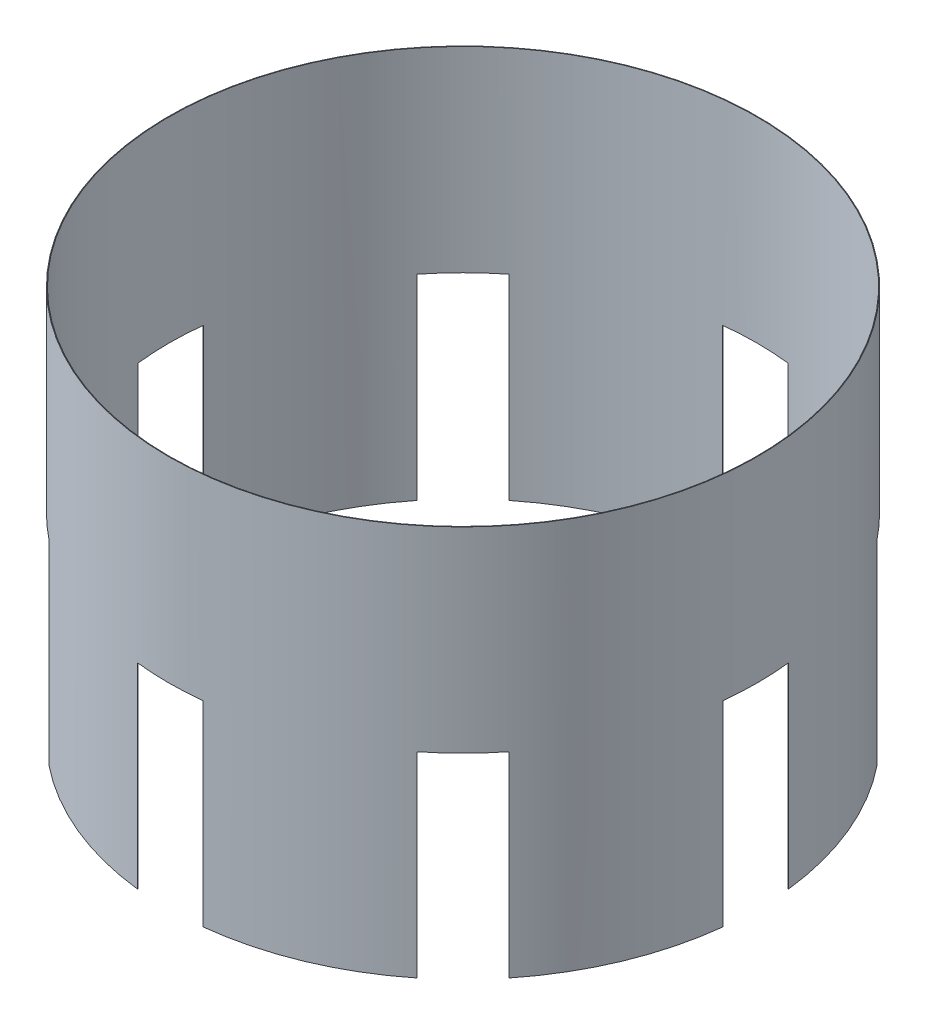
ISO-10303-21;
HEADER;
FILE_DESCRIPTION(('STEP AP214'),'2;1');
FILE_NAME('part.step','',(''),(''),'','','');
FILE_SCHEMA(('AUTOMOTIVE_DESIGN { 1 0 10303 214 1 1 1 1 }'));
ENDSEC;
DATA;
#1=APPLICATION_CONTEXT('core data for automotive mechanical design processes');
#2=APPLICATION_PROTOCOL_DEFINITION('international standard','automotive_design',2000,#1);
#3=PRODUCT_CONTEXT('',#1,'mechanical');
#4=PRODUCT('Part','Part','',(#3));
#5=PRODUCT_RELATED_PRODUCT_CATEGORY('part','',(#4));
#6=PRODUCT_DEFINITION_FORMATION('','',#4);
#7=PRODUCT_DEFINITION_CONTEXT('part definition',#1,'design');
#8=PRODUCT_DEFINITION('design','',#6,#7);
#9=PRODUCT_DEFINITION_SHAPE('','',#8);
#10=(LENGTH_UNIT() NAMED_UNIT(*) SI_UNIT(.MILLI.,.METRE.));
#11=(NAMED_UNIT(*) PLANE_ANGLE_UNIT() SI_UNIT($,.RADIAN.));
#12=(NAMED_UNIT(*) SI_UNIT($,.STERADIAN.) SOLID_ANGLE_UNIT());
#13=UNCERTAINTY_MEASURE_WITH_UNIT(LENGTH_MEASURE(1.E-05),#10,'distance_accuracy_value','');
#14=(GEOMETRIC_REPRESENTATION_CONTEXT(3) GLOBAL_UNCERTAINTY_ASSIGNED_CONTEXT((#13)) GLOBAL_UNIT_ASSIGNED_CONTEXT((#10,
#11,#12)) REPRESENTATION_CONTEXT('',''));
#15=CARTESIAN_POINT('',(0.,0.,0.));
#16=DIRECTION('',(0.,0.,1.));
#17=DIRECTION('',(1.,0.,0.));
#18=AXIS2_PLACEMENT_3D('',#15,#16,#17);
#19=CARTESIAN_POINT('',(0.,1200.,0.));
#20=DIRECTION('',(0.,1.,0.));
#21=DIRECTION('',(0.,0.,1.));
#22=AXIS2_PLACEMENT_3D('',#19,#20,#21);
#23=PLANE('',#22);
#24=CARTESIAN_POINT('',(0.,1200.,0.));
#25=DIRECTION('',(0.,1.,0.));
#26=DIRECTION('',(0.,0.,1.));
#27=AXIS2_PLACEMENT_3D('',#24,#25,#26);
#28=CIRCLE('',#27,451.);
#29=CARTESIAN_POINT('',(-352.294607689771,1200.,-281.583929571115));
#30=VERTEX_POINT('',#29);
#31=CARTESIAN_POINT('',(-448.219812145782,1200.,-49.9999999999988));
#32=VERTEX_POINT('',#31);
#33=EDGE_CURVE('E364',#30,#32,#28,.T.);
#34=ORIENTED_EDGE('',*,*,#33,.F.);
#35=DIRECTION('',(0.707106781186548,0.,0.707106781186547));
#36=VECTOR('',#35,1.);
#37=CARTESIAN_POINT('',(-486.355339059328,1200.,-415.644660940672));
#38=LINE('',#37,#36);
#39=CARTESIAN_POINT('',(-351.583105076166,1200.,-280.87242695751));
#40=VERTEX_POINT('',#39);
#41=EDGE_CURVE('E276',#30,#40,#38,.T.);
#42=ORIENTED_EDGE('',*,*,#41,.T.);
#43=CARTESIAN_POINT('',(0.,1200.,0.));
#44=DIRECTION('',(0.,1.,0.));
#45=DIRECTION('',(0.,0.,1.));
#46=AXIS2_PLACEMENT_3D('',#43,#44,#45);
#47=CIRCLE('',#46,450.);
#48=CARTESIAN_POINT('',(-447.213595499958,1200.,-49.9999999999988));
#49=VERTEX_POINT('',#48);
#50=EDGE_CURVE('E445',#40,#49,#47,.T.);
#51=ORIENTED_EDGE('',*,*,#50,.T.);
#52=DIRECTION('',(1.,0.,0.));
#53=VECTOR('',#52,1.);
#54=CARTESIAN_POINT('',(-451.000000000001,1200.,-49.9999999999988));
#55=LINE('',#54,#53);
#56=EDGE_CURVE('E492',#32,#49,#55,.T.);
#57=ORIENTED_EDGE('',*,*,#56,.F.);
#58=EDGE_LOOP('',(#34,#42,#51,#57));
#59=FACE_BOUND('',#58,.T.);
#60=ADVANCED_FACE('F39',(#59),#23,.F.);
#61=CARTESIAN_POINT('',(-448.219812145782,1200.,50.0000000000012));
#62=VERTEX_POINT('',#61);
#63=CARTESIAN_POINT('',(-352.294607689769,1200.,281.583929571117));
#64=VERTEX_POINT('',#63);
#65=EDGE_CURVE('E274',#62,#64,#28,.T.);
#66=ORIENTED_EDGE('',*,*,#65,.F.);
#67=DIRECTION('',(1.,0.,0.));
#68=VECTOR('',#67,1.);
#69=CARTESIAN_POINT('',(-451.000000000001,1200.,50.0000000000012));
#70=LINE('',#69,#68);
#71=CARTESIAN_POINT('',(-447.213595499958,1200.,50.0000000000012));
#72=VERTEX_POINT('',#71);
#73=EDGE_CURVE('E498',#62,#72,#70,.T.);
#74=ORIENTED_EDGE('',*,*,#73,.T.);
#75=CARTESIAN_POINT('',(-351.583105076164,1200.,280.872426957512));
#76=VERTEX_POINT('',#75);
#77=EDGE_CURVE('E443',#72,#76,#47,.T.);
#78=ORIENTED_EDGE('',*,*,#77,.T.);
#79=DIRECTION('',(0.707106781186545,0.,-0.70710678118655));
#80=VECTOR('',#79,1.);
#81=CARTESIAN_POINT('',(-486.355339059326,1200.,415.644660940674));
#82=LINE('',#81,#80);
#83=EDGE_CURVE('E500',#64,#76,#82,.T.);
#84=ORIENTED_EDGE('',*,*,#83,.F.);
#85=EDGE_LOOP('',(#66,#74,#78,#84));
#86=FACE_BOUND('',#85,.T.);
#87=ADVANCED_FACE('F537',(#86),#23,.F.);
#88=CARTESIAN_POINT('',(-281.583929571114,1200.,352.294607689771));
#89=VERTEX_POINT('',#88);
#90=CARTESIAN_POINT('',(-50.,1200.,448.219812145782));
#91=VERTEX_POINT('',#90);
#92=EDGE_CURVE('E348',#89,#91,#28,.T.);
#93=ORIENTED_EDGE('',*,*,#92,.F.);
#94=DIRECTION('',(0.707106781186545,0.,-0.70710678118655));
#95=VECTOR('',#94,1.);
#96=CARTESIAN_POINT('',(-415.644660940671,1200.,486.355339059329));
#97=LINE('',#96,#95);
#98=CARTESIAN_POINT('',(-280.872426957509,1200.,351.583105076166));
#99=VERTEX_POINT('',#98);
#100=EDGE_CURVE('E493',#89,#99,#97,.T.);
#101=ORIENTED_EDGE('',*,*,#100,.T.);
#102=CARTESIAN_POINT('',(-50.,1200.,447.213595499958));
#103=VERTEX_POINT('',#102);
#104=EDGE_CURVE('E344',#99,#103,#47,.T.);
#105=ORIENTED_EDGE('',*,*,#104,.T.);
#106=DIRECTION('',(0.,0.,1.));
#107=VECTOR('',#106,1.);
#108=CARTESIAN_POINT('',(-50.,1200.,-451.));
#109=LINE('',#108,#107);
#110=EDGE_CURVE('E315',#103,#91,#109,.T.);
#111=ORIENTED_EDGE('',*,*,#110,.T.);
#112=EDGE_LOOP('',(#93,#101,#105,#111));
#113=FACE_BOUND('',#112,.T.);
#114=ADVANCED_FACE('F550',(#113),#23,.F.);
#115=CARTESIAN_POINT('',(352.294607689771,1200.,281.583929571115));
#116=VERTEX_POINT('',#115);
#117=CARTESIAN_POINT('',(448.219812145782,1200.,49.9999999999988));
#118=VERTEX_POINT('',#117);
#119=EDGE_CURVE('E536',#116,#118,#28,.T.);
#120=ORIENTED_EDGE('',*,*,#119,.F.);
#121=DIRECTION('',(0.707106781186548,0.,0.707106781186547));
#122=VECTOR('',#121,1.);
#123=CARTESIAN_POINT('',(-415.644660940673,1200.,-486.355339059327));
#124=LINE('',#123,#122);
#125=CARTESIAN_POINT('',(351.583105076166,1200.,280.87242695751));
#126=VERTEX_POINT('',#125);
#127=EDGE_CURVE('E284',#126,#116,#124,.T.);
#128=ORIENTED_EDGE('',*,*,#127,.F.);
#129=CARTESIAN_POINT('',(447.213595499958,1200.,49.9999999999988));
#130=VERTEX_POINT('',#129);
#131=EDGE_CURVE('E352',#126,#130,#47,.T.);
#132=ORIENTED_EDGE('',*,*,#131,.T.);
#133=EDGE_CURVE('E435',#130,#118,#70,.T.);
#134=ORIENTED_EDGE('',*,*,#133,.T.);
#135=EDGE_LOOP('',(#120,#128,#132,#134));
#136=FACE_BOUND('',#135,.T.);
#137=ADVANCED_FACE('F534',(#136),#23,.F.);
#138=CARTESIAN_POINT('',(447.213595499958,1200.,-50.0000000000012));
#139=VERTEX_POINT('',#138);
#140=CARTESIAN_POINT('',(351.583105076164,1200.,-280.872426957512));
#141=VERTEX_POINT('',#140);
#142=EDGE_CURVE('E452',#139,#141,#47,.T.);
#143=ORIENTED_EDGE('',*,*,#142,.T.);
#144=CARTESIAN_POINT('',(352.294607689769,1200.,-281.583929571117));
#145=VERTEX_POINT('',#144);
#146=EDGE_CURVE('E504',#141,#145,#97,.T.);
#147=ORIENTED_EDGE('',*,*,#146,.T.);
#148=CARTESIAN_POINT('',(448.219812145782,1200.,-50.0000000000012));
#149=VERTEX_POINT('',#148);
#150=EDGE_CURVE('E545',#149,#145,#28,.T.);
#151=ORIENTED_EDGE('',*,*,#150,.F.);
#152=EDGE_CURVE('E490',#139,#149,#55,.T.);
#153=ORIENTED_EDGE('',*,*,#152,.F.);
#154=EDGE_LOOP('',(#143,#147,#151,#153));
#155=FACE_BOUND('',#154,.T.);
#156=ADVANCED_FACE('F556',(#155),#23,.F.);
#157=CARTESIAN_POINT('',(281.583929571114,1200.,-352.294607689771));
#158=VERTEX_POINT('',#157);
#159=CARTESIAN_POINT('',(50.,1200.,-448.219812145782));
#160=VERTEX_POINT('',#159);
#161=EDGE_CURVE('E363',#158,#160,#28,.T.);
#162=ORIENTED_EDGE('',*,*,#161,.F.);
#163=CARTESIAN_POINT('',(280.872426957509,1200.,-351.583105076166));
#164=VERTEX_POINT('',#163);
#165=EDGE_CURVE('E499',#164,#158,#82,.T.);
#166=ORIENTED_EDGE('',*,*,#165,.F.);
#167=CARTESIAN_POINT('',(50.,1200.,-447.213595499958));
#168=VERTEX_POINT('',#167);
#169=EDGE_CURVE('E353',#164,#168,#47,.T.);
#170=ORIENTED_EDGE('',*,*,#169,.T.);
#171=DIRECTION('',(0.,0.,1.));
#172=VECTOR('',#171,1.);
#173=CARTESIAN_POINT('',(50.,1200.,-451.));
#174=LINE('',#173,#172);
#175=EDGE_CURVE('E327',#160,#168,#174,.T.);
#176=ORIENTED_EDGE('',*,*,#175,.F.);
#177=EDGE_LOOP('',(#162,#166,#170,#176));
#178=FACE_BOUND('',#177,.T.);
#179=ADVANCED_FACE('F572',(#178),#23,.F.);
#180=CARTESIAN_POINT('',(-50.,1200.,-447.213595499958));
#181=VERTEX_POINT('',#180);
#182=CARTESIAN_POINT('',(-280.872426957511,1200.,-351.583105076165));
#183=VERTEX_POINT('',#182);
#184=EDGE_CURVE('E354',#181,#183,#47,.T.);
#185=ORIENTED_EDGE('',*,*,#184,.T.);
#186=CARTESIAN_POINT('',(-281.583929571116,1200.,-352.29460768977));
#187=VERTEX_POINT('',#186);
#188=EDGE_CURVE('E474',#187,#183,#124,.T.);
#189=ORIENTED_EDGE('',*,*,#188,.F.);
#190=CARTESIAN_POINT('',(-50.,1200.,-448.219812145782));
#191=VERTEX_POINT('',#190);
#192=EDGE_CURVE('E360',#191,#187,#28,.T.);
#193=ORIENTED_EDGE('',*,*,#192,.F.);
#194=EDGE_CURVE('E318',#191,#181,#109,.T.);
#195=ORIENTED_EDGE('',*,*,#194,.T.);
#196=EDGE_LOOP('',(#185,#189,#193,#195));
#197=FACE_BOUND('',#196,.T.);
#198=ADVANCED_FACE('F472',(#197),#23,.F.);
#199=CARTESIAN_POINT('',(0.,1800.,0.));
#200=DIRECTION('',(0.,1.,0.));
#201=DIRECTION('',(0.,0.,1.));
#202=AXIS2_PLACEMENT_3D('',#199,#200,#201);
#203=PLANE('',#202);
#204=CARTESIAN_POINT('',(0.,1800.,0.));
#205=DIRECTION('',(0.,1.,0.));
#206=DIRECTION('',(0.,0.,1.));
#207=AXIS2_PLACEMENT_3D('',#204,#205,#206);
#208=CIRCLE('',#207,451.);
#209=CARTESIAN_POINT('',(0.,1800.,451.));
#210=VERTEX_POINT('',#209);
#211=EDGE_CURVE('E355',#210,#210,#208,.T.);
#212=ORIENTED_EDGE('',*,*,#211,.T.);
#213=EDGE_LOOP('',(#212));
#214=FACE_BOUND('',#213,.T.);
#215=CARTESIAN_POINT('',(0.,1800.,0.));
#216=DIRECTION('',(0.,1.,0.));
#217=DIRECTION('',(0.,0.,1.));
#218=AXIS2_PLACEMENT_3D('',#215,#216,#217);
#219=CIRCLE('',#218,450.);
#220=CARTESIAN_POINT('',(0.,1800.,450.));
#221=VERTEX_POINT('',#220);
#222=EDGE_CURVE('E345',#221,#221,#219,.T.);
#223=ORIENTED_EDGE('',*,*,#222,.F.);
#224=EDGE_LOOP('',(#223));
#225=FACE_BOUND('',#224,.T.);
#226=ADVANCED_FACE('F564',(#214,#225),#203,.T.);
#227=CARTESIAN_POINT('',(50.,1200.,447.213595499958));
#228=VERTEX_POINT('',#227);
#229=CARTESIAN_POINT('',(280.872426957511,1200.,351.583105076165));
#230=VERTEX_POINT('',#229);
#231=EDGE_CURVE('E349',#228,#230,#47,.T.);
#232=ORIENTED_EDGE('',*,*,#231,.T.);
#233=CARTESIAN_POINT('',(281.583929571116,1200.,352.29460768977));
#234=VERTEX_POINT('',#233);
#235=EDGE_CURVE('E281',#230,#234,#38,.T.);
#236=ORIENTED_EDGE('',*,*,#235,.T.);
#237=CARTESIAN_POINT('',(50.,1200.,448.219812145782));
#238=VERTEX_POINT('',#237);
#239=EDGE_CURVE('E359',#238,#234,#28,.T.);
#240=ORIENTED_EDGE('',*,*,#239,.F.);
#241=EDGE_CURVE('E314',#228,#238,#174,.T.);
#242=ORIENTED_EDGE('',*,*,#241,.F.);
#243=EDGE_LOOP('',(#232,#236,#240,#242));
#244=FACE_BOUND('',#243,.T.);
#245=ADVANCED_FACE('F528',(#244),#23,.F.);
#246=CARTESIAN_POINT('',(0.,1800.,0.));
#247=DIRECTION('',(0.,-1.,0.));
#248=DIRECTION('',(0.,0.,-1.));
#249=AXIS2_PLACEMENT_3D('',#246,#247,#248);
#250=CYLINDRICAL_SURFACE('',#249,451.);
#251=ORIENTED_EDGE('',*,*,#211,.F.);
#252=EDGE_LOOP('',(#251));
#253=FACE_BOUND('',#252,.T.);
#254=CARTESIAN_POINT('',(0.,1500.,0.));
#255=DIRECTION('',(0.,1.,0.));
#256=DIRECTION('',(0.,0.,1.));
#257=AXIS2_PLACEMENT_3D('',#254,#255,#256);
#258=CIRCLE('',#257,451.);
#259=CARTESIAN_POINT('',(281.583929571116,1500.,352.29460768977));
#260=VERTEX_POINT('',#259);
#261=CARTESIAN_POINT('',(352.294607689771,1500.,281.583929571115));
#262=VERTEX_POINT('',#261);
#263=EDGE_CURVE('E261',#260,#262,#258,.T.);
#264=ORIENTED_EDGE('',*,*,#263,.T.);
#265=DIRECTION('',(0.,-1.,0.));
#266=VECTOR('',#265,1.);
#267=CARTESIAN_POINT('',(352.294607689771,1800.,281.583929571115));
#268=LINE('',#267,#266);
#269=EDGE_CURVE('E308',#262,#116,#268,.T.);
#270=ORIENTED_EDGE('',*,*,#269,.T.);
#271=ORIENTED_EDGE('',*,*,#119,.T.);
#272=DIRECTION('',(0.,-1.,0.));
#273=VECTOR('',#272,1.);
#274=CARTESIAN_POINT('',(448.219812145782,1800.,49.9999999999988));
#275=LINE('',#274,#273);
#276=CARTESIAN_POINT('',(448.219812145782,1500.,49.9999999999988));
#277=VERTEX_POINT('',#276);
#278=EDGE_CURVE('E291',#118,#277,#275,.F.);
#279=ORIENTED_EDGE('',*,*,#278,.T.);
#280=CARTESIAN_POINT('',(448.219812145782,1500.,-50.0000000000012));
#281=VERTEX_POINT('',#280);
#282=EDGE_CURVE('E541',#277,#281,#258,.T.);
#283=ORIENTED_EDGE('',*,*,#282,.T.);
#284=DIRECTION('',(0.,-1.,0.));
#285=VECTOR('',#284,1.);
#286=CARTESIAN_POINT('',(448.219812145782,1800.,-50.0000000000012));
#287=LINE('',#286,#285);
#288=EDGE_CURVE('E297',#281,#149,#287,.T.);
#289=ORIENTED_EDGE('',*,*,#288,.T.);
#290=ORIENTED_EDGE('',*,*,#150,.T.);
#291=DIRECTION('',(0.,-1.,0.));
#292=VECTOR('',#291,1.);
#293=CARTESIAN_POINT('',(352.294607689769,1800.,-281.583929571117));
#294=LINE('',#293,#292);
#295=CARTESIAN_POINT('',(352.294607689769,1500.,-281.583929571117));
#296=VERTEX_POINT('',#295);
#297=EDGE_CURVE('E300',#145,#296,#294,.F.);
#298=ORIENTED_EDGE('',*,*,#297,.T.);
#299=CARTESIAN_POINT('',(281.583929571114,1500.,-352.294607689771));
#300=VERTEX_POINT('',#299);
#301=EDGE_CURVE('E539',#296,#300,#258,.T.);
#302=ORIENTED_EDGE('',*,*,#301,.T.);
#303=DIRECTION('',(0.,-1.,0.));
#304=VECTOR('',#303,1.);
#305=CARTESIAN_POINT('',(281.583929571114,1800.,-352.294607689771));
#306=LINE('',#305,#304);
#307=EDGE_CURVE('E294',#300,#158,#306,.T.);
#308=ORIENTED_EDGE('',*,*,#307,.T.);
#309=ORIENTED_EDGE('',*,*,#161,.T.);
#310=DIRECTION('',(0.,-1.,0.));
#311=VECTOR('',#310,1.);
#312=CARTESIAN_POINT('',(50.,1800.,-448.219812145782));
#313=LINE('',#312,#311);
#314=CARTESIAN_POINT('',(50.,1500.,-448.219812145782));
#315=VERTEX_POINT('',#314);
#316=EDGE_CURVE('E329',#160,#315,#313,.F.);
#317=ORIENTED_EDGE('',*,*,#316,.T.);
#318=CARTESIAN_POINT('',(0.,1500.,0.));
#319=DIRECTION('',(0.,1.,0.));
#320=DIRECTION('',(0.,0.,1.));
#321=AXIS2_PLACEMENT_3D('',#318,#319,#320);
#322=CIRCLE('',#321,451.);
#323=CARTESIAN_POINT('',(-50.,1500.,-448.219812145782));
#324=VERTEX_POINT('',#323);
#325=EDGE_CURVE('E337',#315,#324,#322,.T.);
#326=ORIENTED_EDGE('',*,*,#325,.T.);
#327=DIRECTION('',(0.,-1.,0.));
#328=VECTOR('',#327,1.);
#329=CARTESIAN_POINT('',(-50.,1800.,-448.219812145782));
#330=LINE('',#329,#328);
#331=EDGE_CURVE('E341',#324,#191,#330,.T.);
#332=ORIENTED_EDGE('',*,*,#331,.T.);
#333=ORIENTED_EDGE('',*,*,#192,.T.);
#334=DIRECTION('',(0.,-1.,0.));
#335=VECTOR('',#334,1.);
#336=CARTESIAN_POINT('',(-281.583929571116,1800.,-352.29460768977));
#337=LINE('',#336,#335);
#338=CARTESIAN_POINT('',(-281.583929571116,1500.,-352.29460768977));
#339=VERTEX_POINT('',#338);
#340=EDGE_CURVE('E259',#187,#339,#337,.F.);
#341=ORIENTED_EDGE('',*,*,#340,.T.);
#342=CARTESIAN_POINT('',(-352.294607689771,1500.,-281.583929571115));
#343=VERTEX_POINT('',#342);
#344=EDGE_CURVE('E485',#339,#343,#258,.T.);
#345=ORIENTED_EDGE('',*,*,#344,.T.);
#346=DIRECTION('',(0.,-1.,0.));
#347=VECTOR('',#346,1.);
#348=CARTESIAN_POINT('',(-352.294607689771,1800.,-281.583929571115));
#349=LINE('',#348,#347);
#350=EDGE_CURVE('E311',#343,#30,#349,.T.);
#351=ORIENTED_EDGE('',*,*,#350,.T.);
#352=ORIENTED_EDGE('',*,*,#33,.T.);
#353=DIRECTION('',(0.,-1.,0.));
#354=VECTOR('',#353,1.);
#355=CARTESIAN_POINT('',(-448.219812145782,1800.,-49.9999999999988));
#356=LINE('',#355,#354);
#357=CARTESIAN_POINT('',(-448.219812145782,1500.,-49.9999999999988));
#358=VERTEX_POINT('',#357);
#359=EDGE_CURVE('E278',#32,#358,#356,.F.);
#360=ORIENTED_EDGE('',*,*,#359,.T.);
#361=CARTESIAN_POINT('',(-448.219812145782,1500.,50.0000000000012));
#362=VERTEX_POINT('',#361);
#363=EDGE_CURVE('E258',#358,#362,#258,.T.);
#364=ORIENTED_EDGE('',*,*,#363,.T.);
#365=DIRECTION('',(0.,-1.,0.));
#366=VECTOR('',#365,1.);
#367=CARTESIAN_POINT('',(-448.219812145782,1800.,50.0000000000012));
#368=LINE('',#367,#366);
#369=EDGE_CURVE('E289',#362,#62,#368,.T.);
#370=ORIENTED_EDGE('',*,*,#369,.T.);
#371=ORIENTED_EDGE('',*,*,#65,.T.);
#372=DIRECTION('',(0.,-1.,0.));
#373=VECTOR('',#372,1.);
#374=CARTESIAN_POINT('',(-352.294607689769,1800.,281.583929571117));
#375=LINE('',#374,#373);
#376=CARTESIAN_POINT('',(-352.294607689769,1500.,281.583929571117));
#377=VERTEX_POINT('',#376);
#378=EDGE_CURVE('E264',#64,#377,#375,.F.);
#379=ORIENTED_EDGE('',*,*,#378,.T.);
#380=CARTESIAN_POINT('',(-281.583929571114,1500.,352.294607689771));
#381=VERTEX_POINT('',#380);
#382=EDGE_CURVE('E248',#377,#381,#258,.T.);
#383=ORIENTED_EDGE('',*,*,#382,.T.);
#384=DIRECTION('',(0.,-1.,0.));
#385=VECTOR('',#384,1.);
#386=CARTESIAN_POINT('',(-281.583929571114,1800.,352.294607689771));
#387=LINE('',#386,#385);
#388=EDGE_CURVE('E275',#381,#89,#387,.T.);
#389=ORIENTED_EDGE('',*,*,#388,.T.);
#390=ORIENTED_EDGE('',*,*,#92,.T.);
#391=DIRECTION('',(0.,-1.,0.));
#392=VECTOR('',#391,1.);
#393=CARTESIAN_POINT('',(-50.,1800.,448.219812145782));
#394=LINE('',#393,#392);
#395=CARTESIAN_POINT('',(-50.,1500.,448.219812145782));
#396=VERTEX_POINT('',#395);
#397=EDGE_CURVE('E338',#91,#396,#394,.F.);
#398=ORIENTED_EDGE('',*,*,#397,.T.);
#399=CARTESIAN_POINT('',(50.,1500.,448.219812145782));
#400=VERTEX_POINT('',#399);
#401=EDGE_CURVE('E335',#396,#400,#322,.T.);
#402=ORIENTED_EDGE('',*,*,#401,.T.);
#403=DIRECTION('',(0.,-1.,0.));
#404=VECTOR('',#403,1.);
#405=CARTESIAN_POINT('',(50.,1800.,448.219812145782));
#406=LINE('',#405,#404);
#407=EDGE_CURVE('E332',#400,#238,#406,.T.);
#408=ORIENTED_EDGE('',*,*,#407,.T.);
#409=ORIENTED_EDGE('',*,*,#239,.T.);
#410=DIRECTION('',(0.,-1.,0.));
#411=VECTOR('',#410,1.);
#412=CARTESIAN_POINT('',(281.583929571116,1800.,352.29460768977));
#413=LINE('',#412,#411);
#414=EDGE_CURVE('E305',#234,#260,#413,.F.);
#415=ORIENTED_EDGE('',*,*,#414,.T.);
#416=EDGE_LOOP('',(#264,#270,#271,#279,#283,#289,#290,#298,#302,#308,#309,#317,#326,#332,#333,
#341,#345,#351,#352,#360,#364,#370,#371,#379,#383,#389,#390,#398,#402,#408,#409,#415));
#417=FACE_BOUND('',#416,.T.);
#418=ADVANCED_FACE('F41',(#253,#417),#250,.T.);
#419=CARTESIAN_POINT('',(0.,1800.,0.));
#420=DIRECTION('',(0.,-1.,0.));
#421=DIRECTION('',(0.,0.,-1.));
#422=AXIS2_PLACEMENT_3D('',#419,#420,#421);
#423=CYLINDRICAL_SURFACE('',#422,450.);
#424=DIRECTION('',(0.,-1.,0.));
#425=VECTOR('',#424,1.);
#426=CARTESIAN_POINT('',(351.583105076166,1800.,280.87242695751));
#427=LINE('',#426,#425);
#428=CARTESIAN_POINT('',(351.583105076166,1500.,280.87242695751));
#429=VERTEX_POINT('',#428);
#430=EDGE_CURVE('E11',#429,#126,#427,.T.);
#431=ORIENTED_EDGE('',*,*,#430,.F.);
#432=CARTESIAN_POINT('',(0.,1500.,0.));
#433=DIRECTION('',(0.,1.,0.));
#434=DIRECTION('',(0.,0.,1.));
#435=AXIS2_PLACEMENT_3D('',#432,#433,#434);
#436=CIRCLE('',#435,450.);
#437=CARTESIAN_POINT('',(280.872426957511,1500.,351.583105076165));
#438=VERTEX_POINT('',#437);
#439=EDGE_CURVE('E379',#438,#429,#436,.T.);
#440=ORIENTED_EDGE('',*,*,#439,.F.);
#441=DIRECTION('',(0.,-1.,0.));
#442=VECTOR('',#441,1.);
#443=CARTESIAN_POINT('',(280.872426957511,1800.,351.583105076165));
#444=LINE('',#443,#442);
#445=EDGE_CURVE('E47',#230,#438,#444,.F.);
#446=ORIENTED_EDGE('',*,*,#445,.F.);
#447=ORIENTED_EDGE('',*,*,#231,.F.);
#448=DIRECTION('',(0.,-1.,0.));
#449=VECTOR('',#448,1.);
#450=CARTESIAN_POINT('',(50.,1800.,447.213595499958));
#451=LINE('',#450,#449);
#452=CARTESIAN_POINT('',(50.,1500.,447.213595499958));
#453=VERTEX_POINT('',#452);
#454=EDGE_CURVE('E371',#453,#228,#451,.T.);
#455=ORIENTED_EDGE('',*,*,#454,.F.);
#456=CARTESIAN_POINT('',(0.,1500.,0.));
#457=DIRECTION('',(0.,1.,0.));
#458=DIRECTION('',(0.,0.,1.));
#459=AXIS2_PLACEMENT_3D('',#456,#457,#458);
#460=CIRCLE('',#459,450.);
#461=CARTESIAN_POINT('',(-50.,1500.,447.213595499958));
#462=VERTEX_POINT('',#461);
#463=EDGE_CURVE('E369',#462,#453,#460,.T.);
#464=ORIENTED_EDGE('',*,*,#463,.F.);
#465=DIRECTION('',(0.,-1.,0.));
#466=VECTOR('',#465,1.);
#467=CARTESIAN_POINT('',(-50.,1800.,447.213595499958));
#468=LINE('',#467,#466);
#469=EDGE_CURVE('E373',#103,#462,#468,.F.);
#470=ORIENTED_EDGE('',*,*,#469,.F.);
#471=ORIENTED_EDGE('',*,*,#104,.F.);
#472=DIRECTION('',(0.,-1.,0.));
#473=VECTOR('',#472,1.);
#474=CARTESIAN_POINT('',(-280.872426957509,1800.,351.583105076166));
#475=LINE('',#474,#473);
#476=CARTESIAN_POINT('',(-280.872426957509,1500.,351.583105076166));
#477=VERTEX_POINT('',#476);
#478=EDGE_CURVE('E378',#477,#99,#475,.T.);
#479=ORIENTED_EDGE('',*,*,#478,.F.);
#480=CARTESIAN_POINT('',(-351.583105076164,1500.,280.872426957512));
#481=VERTEX_POINT('',#480);
#482=EDGE_CURVE('E376',#481,#477,#436,.T.);
#483=ORIENTED_EDGE('',*,*,#482,.F.);
#484=DIRECTION('',(0.,-1.,0.));
#485=VECTOR('',#484,1.);
#486=CARTESIAN_POINT('',(-351.583105076164,1800.,280.872426957512));
#487=LINE('',#486,#485);
#488=EDGE_CURVE('E267',#76,#481,#487,.F.);
#489=ORIENTED_EDGE('',*,*,#488,.F.);
#490=ORIENTED_EDGE('',*,*,#77,.F.);
#491=DIRECTION('',(0.,-1.,0.));
#492=VECTOR('',#491,1.);
#493=CARTESIAN_POINT('',(-447.213595499958,1800.,50.0000000000012));
#494=LINE('',#493,#492);
#495=CARTESIAN_POINT('',(-447.213595499958,1500.,50.0000000000012));
#496=VERTEX_POINT('',#495);
#497=EDGE_CURVE('E384',#496,#72,#494,.T.);
#498=ORIENTED_EDGE('',*,*,#497,.F.);
#499=CARTESIAN_POINT('',(-447.213595499958,1500.,-49.9999999999988));
#500=VERTEX_POINT('',#499);
#501=EDGE_CURVE('E380',#500,#496,#436,.T.);
#502=ORIENTED_EDGE('',*,*,#501,.F.);
#503=DIRECTION('',(0.,-1.,0.));
#504=VECTOR('',#503,1.);
#505=CARTESIAN_POINT('',(-447.213595499958,1800.,-49.9999999999988));
#506=LINE('',#505,#504);
#507=EDGE_CURVE('E382',#49,#500,#506,.F.);
#508=ORIENTED_EDGE('',*,*,#507,.F.);
#509=ORIENTED_EDGE('',*,*,#50,.F.);
#510=DIRECTION('',(0.,-1.,0.));
#511=VECTOR('',#510,1.);
#512=CARTESIAN_POINT('',(-351.583105076166,1800.,-280.87242695751));
#513=LINE('',#512,#511);
#514=CARTESIAN_POINT('',(-351.583105076166,1500.,-280.87242695751));
#515=VERTEX_POINT('',#514);
#516=EDGE_CURVE('E399',#515,#40,#513,.T.);
#517=ORIENTED_EDGE('',*,*,#516,.F.);
#518=CARTESIAN_POINT('',(-280.872426957511,1500.,-351.583105076165));
#519=VERTEX_POINT('',#518);
#520=EDGE_CURVE('E398',#519,#515,#436,.T.);
#521=ORIENTED_EDGE('',*,*,#520,.F.);
#522=DIRECTION('',(0.,-1.,0.));
#523=VECTOR('',#522,1.);
#524=CARTESIAN_POINT('',(-280.872426957511,1800.,-351.583105076165));
#525=LINE('',#524,#523);
#526=EDGE_CURVE('E396',#183,#519,#525,.F.);
#527=ORIENTED_EDGE('',*,*,#526,.F.);
#528=ORIENTED_EDGE('',*,*,#184,.F.);
#529=DIRECTION('',(0.,-1.,0.));
#530=VECTOR('',#529,1.);
#531=CARTESIAN_POINT('',(-50.,1800.,-447.213595499958));
#532=LINE('',#531,#530);
#533=CARTESIAN_POINT('',(-50.,1500.,-447.213595499958));
#534=VERTEX_POINT('',#533);
#535=EDGE_CURVE('E368',#534,#181,#532,.T.);
#536=ORIENTED_EDGE('',*,*,#535,.F.);
#537=CARTESIAN_POINT('',(50.,1500.,-447.213595499958));
#538=VERTEX_POINT('',#537);
#539=EDGE_CURVE('E366',#538,#534,#460,.T.);
#540=ORIENTED_EDGE('',*,*,#539,.F.);
#541=DIRECTION('',(0.,-1.,0.));
#542=VECTOR('',#541,1.);
#543=CARTESIAN_POINT('',(50.,1800.,-447.213595499958));
#544=LINE('',#543,#542);
#545=EDGE_CURVE('E358',#168,#538,#544,.F.);
#546=ORIENTED_EDGE('',*,*,#545,.F.);
#547=ORIENTED_EDGE('',*,*,#169,.F.);
#548=DIRECTION('',(0.,-1.,0.));
#549=VECTOR('',#548,1.);
#550=CARTESIAN_POINT('',(280.872426957509,1800.,-351.583105076166));
#551=LINE('',#550,#549);
#552=CARTESIAN_POINT('',(280.872426957509,1500.,-351.583105076166));
#553=VERTEX_POINT('',#552);
#554=EDGE_CURVE('E391',#553,#164,#551,.T.);
#555=ORIENTED_EDGE('',*,*,#554,.F.);
#556=CARTESIAN_POINT('',(351.583105076164,1500.,-280.872426957512));
#557=VERTEX_POINT('',#556);
#558=EDGE_CURVE('E393',#557,#553,#436,.T.);
#559=ORIENTED_EDGE('',*,*,#558,.F.);
#560=DIRECTION('',(0.,-1.,0.));
#561=VECTOR('',#560,1.);
#562=CARTESIAN_POINT('',(351.583105076164,1800.,-280.872426957512));
#563=LINE('',#562,#561);
#564=EDGE_CURVE('E394',#141,#557,#563,.F.);
#565=ORIENTED_EDGE('',*,*,#564,.F.);
#566=ORIENTED_EDGE('',*,*,#142,.F.);
#567=DIRECTION('',(0.,-1.,0.));
#568=VECTOR('',#567,1.);
#569=CARTESIAN_POINT('',(447.213595499958,1800.,-50.0000000000012));
#570=LINE('',#569,#568);
#571=CARTESIAN_POINT('',(447.213595499958,1500.,-50.0000000000012));
#572=VERTEX_POINT('',#571);
#573=EDGE_CURVE('E389',#572,#139,#570,.T.);
#574=ORIENTED_EDGE('',*,*,#573,.F.);
#575=CARTESIAN_POINT('',(447.213595499958,1500.,49.9999999999988));
#576=VERTEX_POINT('',#575);
#577=EDGE_CURVE('E388',#576,#572,#436,.T.);
#578=ORIENTED_EDGE('',*,*,#577,.F.);
#579=DIRECTION('',(0.,-1.,0.));
#580=VECTOR('',#579,1.);
#581=CARTESIAN_POINT('',(447.213595499958,1800.,49.9999999999988));
#582=LINE('',#581,#580);
#583=EDGE_CURVE('E386',#130,#576,#582,.F.);
#584=ORIENTED_EDGE('',*,*,#583,.F.);
#585=ORIENTED_EDGE('',*,*,#131,.F.);
#586=EDGE_LOOP('',(#431,#440,#446,#447,#455,#464,#470,#471,#479,#483,#489,#490,#498,#502,#508,
#509,#517,#521,#527,#528,#536,#540,#546,#547,#555,#559,#565,#566,#574,#578,#584,#585));
#587=FACE_BOUND('',#586,.T.);
#588=ORIENTED_EDGE('',*,*,#222,.T.);
#589=EDGE_LOOP('',(#588));
#590=FACE_BOUND('',#589,.T.);
#591=ADVANCED_FACE('F440',(#587,#590),#423,.F.);
#592=CARTESIAN_POINT('',(50.,1500.,-451.));
#593=DIRECTION('',(1.,0.,0.));
#594=DIRECTION('',(0.,1.,0.));
#595=AXIS2_PLACEMENT_3D('',#592,#593,#594);
#596=PLANE('',#595);
#597=ORIENTED_EDGE('',*,*,#175,.T.);
#598=ORIENTED_EDGE('',*,*,#545,.T.);
#599=DIRECTION('',(0.,0.,1.));
#600=VECTOR('',#599,1.);
#601=CARTESIAN_POINT('',(50.,1500.,-451.));
#602=LINE('',#601,#600);
#603=EDGE_CURVE('E323',#315,#538,#602,.T.);
#604=ORIENTED_EDGE('',*,*,#603,.F.);
#605=ORIENTED_EDGE('',*,*,#316,.F.);
#606=EDGE_LOOP('',(#597,#598,#604,#605));
#607=FACE_BOUND('',#606,.T.);
#608=ADVANCED_FACE('F581',(#607),#596,.F.);
#609=CARTESIAN_POINT('',(-50.,1500.,-451.));
#610=DIRECTION('',(0.,1.,0.));
#611=DIRECTION('',(0.,0.,1.));
#612=AXIS2_PLACEMENT_3D('',#609,#610,#611);
#613=PLANE('',#612);
#614=ORIENTED_EDGE('',*,*,#603,.T.);
#615=ORIENTED_EDGE('',*,*,#539,.T.);
#616=DIRECTION('',(0.,0.,1.));
#617=VECTOR('',#616,1.);
#618=CARTESIAN_POINT('',(-50.,1500.,-451.));
#619=LINE('',#618,#617);
#620=EDGE_CURVE('E319',#324,#534,#619,.T.);
#621=ORIENTED_EDGE('',*,*,#620,.F.);
#622=ORIENTED_EDGE('',*,*,#325,.F.);
#623=EDGE_LOOP('',(#614,#615,#621,#622));
#624=FACE_BOUND('',#623,.T.);
#625=ADVANCED_FACE('F587',(#624),#613,.F.);
#626=CARTESIAN_POINT('',(-50.,1200.,-451.));
#627=DIRECTION('',(-1.,0.,0.));
#628=DIRECTION('',(0.,0.,1.));
#629=AXIS2_PLACEMENT_3D('',#626,#627,#628);
#630=PLANE('',#629);
#631=ORIENTED_EDGE('',*,*,#620,.T.);
#632=ORIENTED_EDGE('',*,*,#535,.T.);
#633=ORIENTED_EDGE('',*,*,#194,.F.);
#634=ORIENTED_EDGE('',*,*,#331,.F.);
#635=EDGE_LOOP('',(#631,#632,#633,#634));
#636=FACE_BOUND('',#635,.T.);
#637=ADVANCED_FACE('F590',(#636),#630,.F.);
#638=ORIENTED_EDGE('',*,*,#110,.F.);
#639=ORIENTED_EDGE('',*,*,#469,.T.);
#640=EDGE_CURVE('E320',#462,#396,#619,.T.);
#641=ORIENTED_EDGE('',*,*,#640,.T.);
#642=ORIENTED_EDGE('',*,*,#397,.F.);
#643=EDGE_LOOP('',(#638,#639,#641,#642));
#644=FACE_BOUND('',#643,.T.);
#645=ADVANCED_FACE('F516',(#644),#630,.F.);
#646=ORIENTED_EDGE('',*,*,#401,.F.);
#647=ORIENTED_EDGE('',*,*,#640,.F.);
#648=ORIENTED_EDGE('',*,*,#463,.T.);
#649=EDGE_CURVE('E324',#453,#400,#602,.T.);
#650=ORIENTED_EDGE('',*,*,#649,.T.);
#651=EDGE_LOOP('',(#646,#647,#648,#650));
#652=FACE_BOUND('',#651,.T.);
#653=ADVANCED_FACE('F519',(#652),#613,.F.);
#654=ORIENTED_EDGE('',*,*,#649,.F.);
#655=ORIENTED_EDGE('',*,*,#454,.T.);
#656=ORIENTED_EDGE('',*,*,#241,.T.);
#657=ORIENTED_EDGE('',*,*,#407,.F.);
#658=EDGE_LOOP('',(#654,#655,#656,#657));
#659=FACE_BOUND('',#658,.T.);
#660=ADVANCED_FACE('F524',(#659),#596,.F.);
#661=CARTESIAN_POINT('',(-415.644660940671,1200.,486.355339059329));
#662=DIRECTION('',(0.70710678118655,0.,0.707106781186545));
#663=DIRECTION('',(0.707106781186545,0.,-0.70710678118655));
#664=AXIS2_PLACEMENT_3D('',#661,#662,#663);
#665=PLANE('',#664);
#666=DIRECTION('',(0.707106781186545,0.,-0.70710678118655));
#667=VECTOR('',#666,1.);
#668=CARTESIAN_POINT('',(-415.644660940671,1500.,486.355339059329));
#669=LINE('',#668,#667);
#670=EDGE_CURVE('E254',#381,#477,#669,.T.);
#671=ORIENTED_EDGE('',*,*,#670,.T.);
#672=ORIENTED_EDGE('',*,*,#478,.T.);
#673=ORIENTED_EDGE('',*,*,#100,.F.);
#674=ORIENTED_EDGE('',*,*,#388,.F.);
#675=EDGE_LOOP('',(#671,#672,#673,#674));
#676=FACE_BOUND('',#675,.T.);
#677=ADVANCED_FACE('F509',(#676),#665,.F.);
#678=CARTESIAN_POINT('',(-486.355339059326,1500.,415.644660940674));
#679=DIRECTION('',(-0.70710678118655,0.,-0.707106781186545));
#680=DIRECTION('',(-0.707106781186545,0.,0.70710678118655));
#681=AXIS2_PLACEMENT_3D('',#678,#679,#680);
#682=PLANE('',#681);
#683=ORIENTED_EDGE('',*,*,#83,.T.);
#684=ORIENTED_EDGE('',*,*,#488,.T.);
#685=DIRECTION('',(0.707106781186545,0.,-0.70710678118655));
#686=VECTOR('',#685,1.);
#687=CARTESIAN_POINT('',(-486.355339059326,1500.,415.644660940674));
#688=LINE('',#687,#686);
#689=EDGE_CURVE('E251',#377,#481,#688,.T.);
#690=ORIENTED_EDGE('',*,*,#689,.F.);
#691=ORIENTED_EDGE('',*,*,#378,.F.);
#692=EDGE_LOOP('',(#683,#684,#690,#691));
#693=FACE_BOUND('',#692,.T.);
#694=ADVANCED_FACE('F263',(#693),#682,.F.);
#695=CARTESIAN_POINT('',(-486.355339059328,1500.,-415.644660940672));
#696=DIRECTION('',(0.,1.,0.));
#697=DIRECTION('',(0.,0.,1.));
#698=AXIS2_PLACEMENT_3D('',#695,#696,#697);
#699=PLANE('',#698);
#700=ORIENTED_EDGE('',*,*,#689,.T.);
#701=ORIENTED_EDGE('',*,*,#482,.T.);
#702=ORIENTED_EDGE('',*,*,#670,.F.);
#703=ORIENTED_EDGE('',*,*,#382,.F.);
#704=EDGE_LOOP('',(#700,#701,#702,#703));
#705=FACE_BOUND('',#704,.T.);
#706=ADVANCED_FACE('F250',(#705),#699,.F.);
#707=CARTESIAN_POINT('',(-451.000000000001,1200.,50.0000000000012));
#708=DIRECTION('',(0.,0.,1.));
#709=DIRECTION('',(1.,0.,0.));
#710=AXIS2_PLACEMENT_3D('',#707,#708,#709);
#711=PLANE('',#710);
#712=DIRECTION('',(1.,0.,0.));
#713=VECTOR('',#712,1.);
#714=CARTESIAN_POINT('',(-451.000000000001,1500.,50.0000000000012));
#715=LINE('',#714,#713);
#716=EDGE_CURVE('E425',#362,#496,#715,.T.);
#717=ORIENTED_EDGE('',*,*,#716,.T.);
#718=ORIENTED_EDGE('',*,*,#497,.T.);
#719=ORIENTED_EDGE('',*,*,#73,.F.);
#720=ORIENTED_EDGE('',*,*,#369,.F.);
#721=EDGE_LOOP('',(#717,#718,#719,#720));
#722=FACE_BOUND('',#721,.T.);
#723=ADVANCED_FACE('F433',(#722),#711,.F.);
#724=CARTESIAN_POINT('',(-451.000000000001,1500.,-49.9999999999988));
#725=DIRECTION('',(0.,0.,-1.));
#726=DIRECTION('',(-1.,0.,0.));
#727=AXIS2_PLACEMENT_3D('',#724,#725,#726);
#728=PLANE('',#727);
#729=ORIENTED_EDGE('',*,*,#56,.T.);
#730=ORIENTED_EDGE('',*,*,#507,.T.);
#731=DIRECTION('',(1.,0.,0.));
#732=VECTOR('',#731,1.);
#733=CARTESIAN_POINT('',(-451.000000000001,1500.,-49.9999999999988));
#734=LINE('',#733,#732);
#735=EDGE_CURVE('E427',#358,#500,#734,.T.);
#736=ORIENTED_EDGE('',*,*,#735,.F.);
#737=ORIENTED_EDGE('',*,*,#359,.F.);
#738=EDGE_LOOP('',(#729,#730,#736,#737));
#739=FACE_BOUND('',#738,.T.);
#740=ADVANCED_FACE('F672',(#739),#728,.F.);
#741=ORIENTED_EDGE('',*,*,#735,.T.);
#742=ORIENTED_EDGE('',*,*,#501,.T.);
#743=ORIENTED_EDGE('',*,*,#716,.F.);
#744=ORIENTED_EDGE('',*,*,#363,.F.);
#745=EDGE_LOOP('',(#741,#742,#743,#744));
#746=FACE_BOUND('',#745,.T.);
#747=ADVANCED_FACE('F424',(#746),#699,.F.);
#748=EDGE_CURVE('E494',#572,#281,#734,.T.);
#749=ORIENTED_EDGE('',*,*,#748,.F.);
#750=ORIENTED_EDGE('',*,*,#573,.T.);
#751=ORIENTED_EDGE('',*,*,#152,.T.);
#752=ORIENTED_EDGE('',*,*,#288,.F.);
#753=EDGE_LOOP('',(#749,#750,#751,#752));
#754=FACE_BOUND('',#753,.T.);
#755=ADVANCED_FACE('F682',(#754),#728,.F.);
#756=ORIENTED_EDGE('',*,*,#133,.F.);
#757=ORIENTED_EDGE('',*,*,#583,.T.);
#758=EDGE_CURVE('E436',#576,#277,#715,.T.);
#759=ORIENTED_EDGE('',*,*,#758,.T.);
#760=ORIENTED_EDGE('',*,*,#278,.F.);
#761=EDGE_LOOP('',(#756,#757,#759,#760));
#762=FACE_BOUND('',#761,.T.);
#763=ADVANCED_FACE('F674',(#762),#711,.F.);
#764=ORIENTED_EDGE('',*,*,#758,.F.);
#765=ORIENTED_EDGE('',*,*,#577,.T.);
#766=ORIENTED_EDGE('',*,*,#748,.T.);
#767=ORIENTED_EDGE('',*,*,#282,.F.);
#768=EDGE_LOOP('',(#764,#765,#766,#767));
#769=FACE_BOUND('',#768,.T.);
#770=ADVANCED_FACE('F699',(#769),#699,.F.);
#771=EDGE_CURVE('E62',#553,#300,#688,.T.);
#772=ORIENTED_EDGE('',*,*,#771,.F.);
#773=ORIENTED_EDGE('',*,*,#554,.T.);
#774=ORIENTED_EDGE('',*,*,#165,.T.);
#775=ORIENTED_EDGE('',*,*,#307,.F.);
#776=EDGE_LOOP('',(#772,#773,#774,#775));
#777=FACE_BOUND('',#776,.T.);
#778=ADVANCED_FACE('F661',(#777),#682,.F.);
#779=ORIENTED_EDGE('',*,*,#146,.F.);
#780=ORIENTED_EDGE('',*,*,#564,.T.);
#781=EDGE_CURVE('E268',#557,#296,#669,.T.);
#782=ORIENTED_EDGE('',*,*,#781,.T.);
#783=ORIENTED_EDGE('',*,*,#297,.F.);
#784=EDGE_LOOP('',(#779,#780,#782,#783));
#785=FACE_BOUND('',#784,.T.);
#786=ADVANCED_FACE('F654',(#785),#665,.F.);
#787=ORIENTED_EDGE('',*,*,#781,.F.);
#788=ORIENTED_EDGE('',*,*,#558,.T.);
#789=ORIENTED_EDGE('',*,*,#771,.T.);
#790=ORIENTED_EDGE('',*,*,#301,.F.);
#791=EDGE_LOOP('',(#787,#788,#789,#790));
#792=FACE_BOUND('',#791,.T.);
#793=ADVANCED_FACE('F706',(#792),#699,.F.);
#794=CARTESIAN_POINT('',(-415.644660940673,1500.,-486.355339059327));
#795=DIRECTION('',(0.707106781186547,0.,-0.707106781186548));
#796=DIRECTION('',(-0.707106781186548,0.,-0.707106781186547));
#797=AXIS2_PLACEMENT_3D('',#794,#795,#796);
#798=PLANE('',#797);
#799=ORIENTED_EDGE('',*,*,#188,.T.);
#800=ORIENTED_EDGE('',*,*,#526,.T.);
#801=DIRECTION('',(0.707106781186548,0.,0.707106781186547));
#802=VECTOR('',#801,1.);
#803=CARTESIAN_POINT('',(-415.644660940673,1500.,-486.355339059327));
#804=LINE('',#803,#802);
#805=EDGE_CURVE('E482',#339,#519,#804,.T.);
#806=ORIENTED_EDGE('',*,*,#805,.F.);
#807=ORIENTED_EDGE('',*,*,#340,.F.);
#808=EDGE_LOOP('',(#799,#800,#806,#807));
#809=FACE_BOUND('',#808,.T.);
#810=ADVANCED_FACE('F481',(#809),#798,.F.);
#811=ORIENTED_EDGE('',*,*,#805,.T.);
#812=ORIENTED_EDGE('',*,*,#520,.T.);
#813=DIRECTION('',(0.707106781186548,0.,0.707106781186547));
#814=VECTOR('',#813,1.);
#815=CARTESIAN_POINT('',(-486.355339059328,1500.,-415.644660940672));
#816=LINE('',#815,#814);
#817=EDGE_CURVE('E487',#343,#515,#816,.T.);
#818=ORIENTED_EDGE('',*,*,#817,.F.);
#819=ORIENTED_EDGE('',*,*,#344,.F.);
#820=EDGE_LOOP('',(#811,#812,#818,#819));
#821=FACE_BOUND('',#820,.T.);
#822=ADVANCED_FACE('F483',(#821),#699,.F.);
#823=CARTESIAN_POINT('',(-486.355339059328,1200.,-415.644660940672));
#824=DIRECTION('',(-0.707106781186547,0.,0.707106781186548));
#825=DIRECTION('',(0.707106781186548,0.,0.707106781186547));
#826=AXIS2_PLACEMENT_3D('',#823,#824,#825);
#827=PLANE('',#826);
#828=ORIENTED_EDGE('',*,*,#817,.T.);
#829=ORIENTED_EDGE('',*,*,#516,.T.);
#830=ORIENTED_EDGE('',*,*,#41,.F.);
#831=ORIENTED_EDGE('',*,*,#350,.F.);
#832=EDGE_LOOP('',(#828,#829,#830,#831));
#833=FACE_BOUND('',#832,.T.);
#834=ADVANCED_FACE('F733',(#833),#827,.F.);
#835=EDGE_CURVE('E486',#429,#262,#804,.T.);
#836=ORIENTED_EDGE('',*,*,#835,.F.);
#837=ORIENTED_EDGE('',*,*,#430,.T.);
#838=ORIENTED_EDGE('',*,*,#127,.T.);
#839=ORIENTED_EDGE('',*,*,#269,.F.);
#840=EDGE_LOOP('',(#836,#837,#838,#839));
#841=FACE_BOUND('',#840,.T.);
#842=ADVANCED_FACE('F532',(#841),#798,.F.);
#843=ORIENTED_EDGE('',*,*,#235,.F.);
#844=ORIENTED_EDGE('',*,*,#445,.T.);
#845=EDGE_CURVE('E54',#438,#260,#816,.T.);
#846=ORIENTED_EDGE('',*,*,#845,.T.);
#847=ORIENTED_EDGE('',*,*,#414,.F.);
#848=EDGE_LOOP('',(#843,#844,#846,#847));
#849=FACE_BOUND('',#848,.T.);
#850=ADVANCED_FACE('F544',(#849),#827,.F.);
#851=ORIENTED_EDGE('',*,*,#845,.F.);
#852=ORIENTED_EDGE('',*,*,#439,.T.);
#853=ORIENTED_EDGE('',*,*,#835,.T.);
#854=ORIENTED_EDGE('',*,*,#263,.F.);
#855=EDGE_LOOP('',(#851,#852,#853,#854));
#856=FACE_BOUND('',#855,.T.);
#857=ADVANCED_FACE('F543',(#856),#699,.F.);
#858=CLOSED_SHELL('',(#60,#87,#114,#137,#156,#179,#198,#226,#245,#418,#591,#608,#625,#637,#645,
#653,#660,#677,#694,#706,#723,#740,#747,#755,#763,#770,#778,#786,#793,#810,#822,#834,#842,#850,#857));
#859=MANIFOLD_SOLID_BREP('B2',#858);
#860=ADVANCED_BREP_SHAPE_REPRESENTATION('',(#18,#859),#14);
#861=SHAPE_DEFINITION_REPRESENTATION(#9,#860);
ENDSEC;
END-ISO-10303-21;
